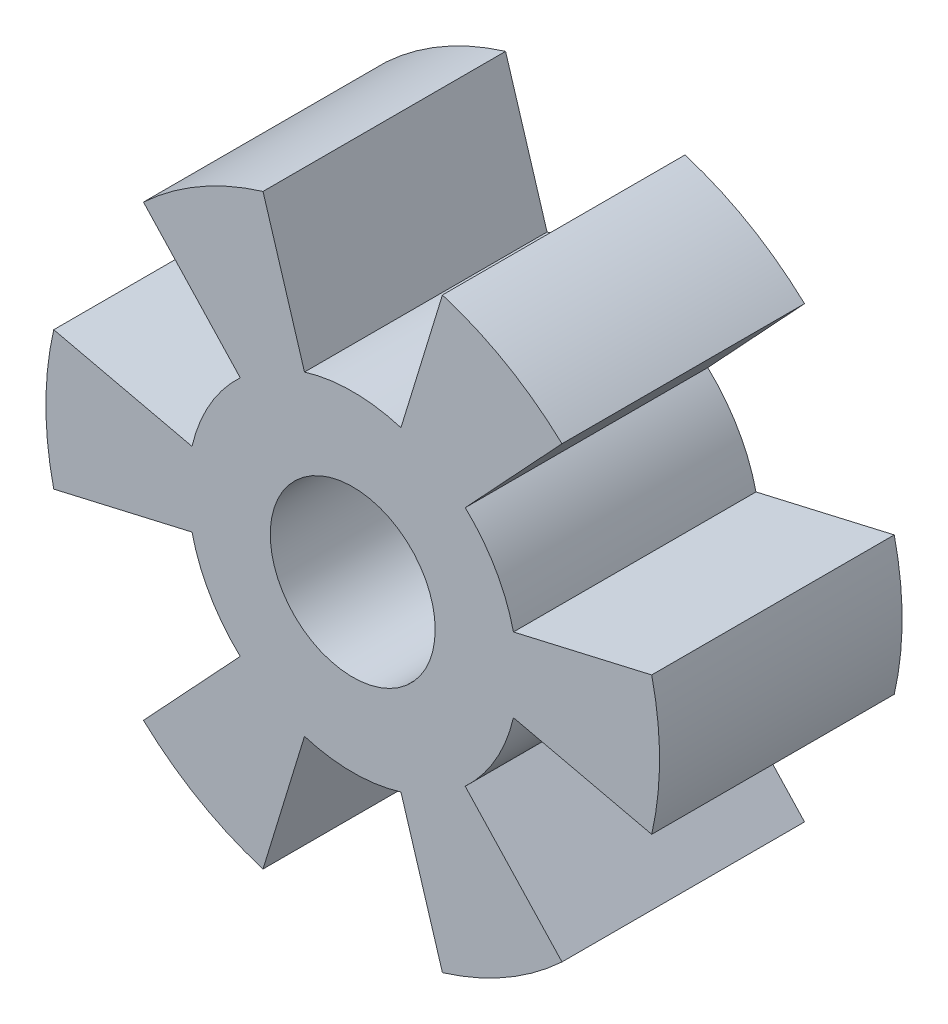
ISO-10303-21;
HEADER;
FILE_DESCRIPTION(('STEP AP214'),'2;1');
FILE_NAME('part.step','',(''),(''),'','','');
FILE_SCHEMA(('AUTOMOTIVE_DESIGN { 1 0 10303 214 1 1 1 1 }'));
ENDSEC;
DATA;
#1=APPLICATION_CONTEXT('core data for automotive mechanical design processes');
#2=APPLICATION_PROTOCOL_DEFINITION('international standard','automotive_design',2000,#1);
#3=PRODUCT_CONTEXT('',#1,'mechanical');
#4=PRODUCT('Part','Part','',(#3));
#5=PRODUCT_RELATED_PRODUCT_CATEGORY('part','',(#4));
#6=PRODUCT_DEFINITION_FORMATION('','',#4);
#7=PRODUCT_DEFINITION_CONTEXT('part definition',#1,'design');
#8=PRODUCT_DEFINITION('design','',#6,#7);
#9=PRODUCT_DEFINITION_SHAPE('','',#8);
#10=(LENGTH_UNIT() NAMED_UNIT(*) SI_UNIT(.MILLI.,.METRE.));
#11=(NAMED_UNIT(*) PLANE_ANGLE_UNIT() SI_UNIT($,.RADIAN.));
#12=(NAMED_UNIT(*) SI_UNIT($,.STERADIAN.) SOLID_ANGLE_UNIT());
#13=UNCERTAINTY_MEASURE_WITH_UNIT(LENGTH_MEASURE(1.E-05),#10,'distance_accuracy_value','');
#14=(GEOMETRIC_REPRESENTATION_CONTEXT(3) GLOBAL_UNCERTAINTY_ASSIGNED_CONTEXT((#13)) GLOBAL_UNIT_ASSIGNED_CONTEXT((#10,
#11,#12)) REPRESENTATION_CONTEXT('',''));
#15=CARTESIAN_POINT('',(0.,0.,0.));
#16=DIRECTION('',(0.,0.,1.));
#17=DIRECTION('',(1.,0.,0.));
#18=AXIS2_PLACEMENT_3D('',#15,#16,#17);
#19=CARTESIAN_POINT('',(0.,0.,10.));
#20=DIRECTION('',(0.,0.,-1.));
#21=DIRECTION('',(1.,0.,0.));
#22=AXIS2_PLACEMENT_3D('',#19,#20,#21);
#23=CYLINDRICAL_SURFACE('',#22,3.4);
#24=CARTESIAN_POINT('',(0.,0.,20.));
#25=DIRECTION('',(0.,0.,1.));
#26=DIRECTION('',(1.,0.,0.));
#27=AXIS2_PLACEMENT_3D('',#24,#25,#26);
#28=CIRCLE('',#27,3.4);
#29=CARTESIAN_POINT('',(3.40000000000003,0.,20.));
#30=VERTEX_POINT('',#29);
#31=EDGE_CURVE('E386',#30,#30,#28,.T.);
#32=ORIENTED_EDGE('',*,*,#31,.T.);
#33=EDGE_LOOP('',(#32));
#34=FACE_BOUND('',#33,.T.);
#35=CARTESIAN_POINT('',(0.,0.,10.));
#36=DIRECTION('',(0.,0.,1.));
#37=DIRECTION('',(1.,0.,0.));
#38=AXIS2_PLACEMENT_3D('',#35,#36,#37);
#39=CIRCLE('',#38,3.4);
#40=CARTESIAN_POINT('',(3.40000000000003,0.,10.));
#41=VERTEX_POINT('',#40);
#42=EDGE_CURVE('E262',#41,#41,#39,.T.);
#43=ORIENTED_EDGE('',*,*,#42,.F.);
#44=EDGE_LOOP('',(#43));
#45=FACE_BOUND('',#44,.T.);
#46=ADVANCED_FACE('F17',(#34,#45),#23,.F.);
#47=CARTESIAN_POINT('',(0.,0.,10.));
#48=DIRECTION('',(0.,0.,-1.));
#49=DIRECTION('',(1.,0.,0.));
#50=AXIS2_PLACEMENT_3D('',#47,#48,#49);
#51=CYLINDRICAL_SURFACE('',#50,6.8);
#52=DIRECTION('',(0.,0.,-1.));
#53=VECTOR('',#52,1.);
#54=CARTESIAN_POINT('',(1.988127592115,-6.502872340549,10.));
#55=LINE('',#54,#53);
#56=CARTESIAN_POINT('',(1.988127592114,-6.502872340549,20.));
#57=VERTEX_POINT('',#56);
#58=CARTESIAN_POINT('',(1.988127592114,-6.502872340549,10.));
#59=VERTEX_POINT('',#58);
#60=EDGE_CURVE('E11',#57,#59,#55,.T.);
#61=ORIENTED_EDGE('',*,*,#60,.F.);
#62=CARTESIAN_POINT('',(0.,0.,20.));
#63=DIRECTION('',(0.,0.,1.));
#64=DIRECTION('',(1.,0.,0.));
#65=AXIS2_PLACEMENT_3D('',#62,#63,#64);
#66=CIRCLE('',#65,6.8);
#67=CARTESIAN_POINT('',(-1.988127592114,-6.502872340549,20.));
#68=VERTEX_POINT('',#67);
#69=EDGE_CURVE('E237',#68,#57,#66,.T.);
#70=ORIENTED_EDGE('',*,*,#69,.F.);
#71=DIRECTION('',(0.,0.,-1.));
#72=VECTOR('',#71,1.);
#73=CARTESIAN_POINT('',(-1.988127592115,-6.502872340549,10.));
#74=LINE('',#73,#72);
#75=CARTESIAN_POINT('',(-1.988127592114,-6.502872340549,10.));
#76=VERTEX_POINT('',#75);
#77=EDGE_CURVE('E234',#68,#76,#74,.T.);
#78=ORIENTED_EDGE('',*,*,#77,.T.);
#79=CARTESIAN_POINT('',(0.,0.,10.));
#80=DIRECTION('',(0.,0.,1.));
#81=DIRECTION('',(1.,0.,0.));
#82=AXIS2_PLACEMENT_3D('',#79,#80,#81);
#83=CIRCLE('',#82,6.8);
#84=EDGE_CURVE('E240',#76,#59,#83,.T.);
#85=ORIENTED_EDGE('',*,*,#84,.T.);
#86=EDGE_LOOP('',(#61,#70,#78,#85));
#87=FACE_BOUND('',#86,.T.);
#88=ADVANCED_FACE('F233',(#87),#51,.T.);
#89=CARTESIAN_POINT('',(0.994063796057,-3.251436170274,10.));
#90=DIRECTION('',(0.956304755962959,0.292371704722988,0.));
#91=DIRECTION('',(0.,0.,-1.));
#92=AXIS2_PLACEMENT_3D('',#89,#90,#91);
#93=PLANE('',#92);
#94=DIRECTION('',(0.,0.,1.));
#95=VECTOR('',#94,1.);
#96=CARTESIAN_POINT('',(3.698502064743,-12.09725516293,10.));
#97=LINE('',#96,#95);
#98=CARTESIAN_POINT('',(3.698502064743,-12.09725516293,10.));
#99=VERTEX_POINT('',#98);
#100=CARTESIAN_POINT('',(3.698502064743,-12.09725516293,20.));
#101=VERTEX_POINT('',#100);
#102=EDGE_CURVE('E20',#99,#101,#97,.T.);
#103=ORIENTED_EDGE('',*,*,#102,.T.);
#104=DIRECTION('',(0.292371704722988,-0.956304755962959,0.));
#105=VECTOR('',#104,1.);
#106=CARTESIAN_POINT('',(0.994063796057,-3.251436170274,20.));
#107=LINE('',#106,#105);
#108=EDGE_CURVE('E395',#57,#101,#107,.T.);
#109=ORIENTED_EDGE('',*,*,#108,.F.);
#110=ORIENTED_EDGE('',*,*,#60,.T.);
#111=DIRECTION('',(0.292371704722988,-0.956304755962959,0.));
#112=VECTOR('',#111,1.);
#113=CARTESIAN_POINT('',(0.994063796057,-3.251436170274,10.));
#114=LINE('',#113,#112);
#115=EDGE_CURVE('E254',#59,#99,#114,.T.);
#116=ORIENTED_EDGE('',*,*,#115,.T.);
#117=EDGE_LOOP('',(#103,#109,#110,#116));
#118=FACE_BOUND('',#117,.T.);
#119=ADVANCED_FACE('F509',(#118),#93,.F.);
#120=CARTESIAN_POINT('',(0.,0.,10.));
#121=DIRECTION('',(0.,0.,-1.));
#122=DIRECTION('',(0.292371704722988,-0.956304755962959,0.));
#123=AXIS2_PLACEMENT_3D('',#120,#121,#122);
#124=CYLINDRICAL_SURFACE('',#123,12.65);
#125=CARTESIAN_POINT('',(0.,0.,10.));
#126=DIRECTION('',(0.,0.,1.));
#127=DIRECTION('',(0.292371704722988,-0.956304755962959,0.));
#128=AXIS2_PLACEMENT_3D('',#125,#126,#127);
#129=CIRCLE('',#128,12.65);
#130=CARTESIAN_POINT('',(8.627279254791,-9.251624325483,10.));
#131=VERTEX_POINT('',#130);
#132=EDGE_CURVE('E320',#99,#131,#129,.T.);
#133=ORIENTED_EDGE('',*,*,#132,.T.);
#134=DIRECTION('',(0.,0.,1.));
#135=VECTOR('',#134,1.);
#136=CARTESIAN_POINT('',(8.627279254791,-9.251624325483,10.));
#137=LINE('',#136,#135);
#138=CARTESIAN_POINT('',(8.627279254791,-9.251624325483,20.));
#139=VERTEX_POINT('',#138);
#140=EDGE_CURVE('E500',#131,#139,#137,.T.);
#141=ORIENTED_EDGE('',*,*,#140,.T.);
#142=CARTESIAN_POINT('',(0.,0.,20.));
#143=DIRECTION('',(0.,0.,1.));
#144=DIRECTION('',(0.292371704722988,-0.956304755962959,0.));
#145=AXIS2_PLACEMENT_3D('',#142,#143,#144);
#146=CIRCLE('',#145,12.65);
#147=EDGE_CURVE('E396',#101,#139,#146,.T.);
#148=ORIENTED_EDGE('',*,*,#147,.F.);
#149=ORIENTED_EDGE('',*,*,#102,.F.);
#150=EDGE_LOOP('',(#133,#141,#148,#149));
#151=FACE_BOUND('',#150,.T.);
#152=ADVANCED_FACE('F506',(#151),#124,.T.);
#153=CARTESIAN_POINT('',(8.627279254791,-9.251624325483,10.));
#154=DIRECTION('',(-0.73135370161934,-0.681998360062317,0.));
#155=DIRECTION('',(-0.681998360062317,0.73135370161934,0.));
#156=AXIS2_PLACEMENT_3D('',#153,#154,#155);
#157=PLANE('',#156);
#158=DIRECTION('',(0.,0.,-1.));
#159=VECTOR('',#158,1.);
#160=CARTESIAN_POINT('',(4.637588848425,-4.97320517101,10.));
#161=LINE('',#160,#159);
#162=CARTESIAN_POINT('',(4.637588848425,-4.97320517101,20.));
#163=VERTEX_POINT('',#162);
#164=CARTESIAN_POINT('',(4.637588848425,-4.97320517101,10.));
#165=VERTEX_POINT('',#164);
#166=EDGE_CURVE('E494',#163,#165,#161,.T.);
#167=ORIENTED_EDGE('',*,*,#166,.F.);
#168=DIRECTION('',(-0.681998360062317,0.73135370161934,0.));
#169=VECTOR('',#168,1.);
#170=CARTESIAN_POINT('',(8.627279254791,-9.251624325483,20.));
#171=LINE('',#170,#169);
#172=EDGE_CURVE('E403',#139,#163,#171,.T.);
#173=ORIENTED_EDGE('',*,*,#172,.F.);
#174=ORIENTED_EDGE('',*,*,#140,.F.);
#175=DIRECTION('',(-0.681998360062317,0.73135370161934,0.));
#176=VECTOR('',#175,1.);
#177=CARTESIAN_POINT('',(8.627279254791,-9.251624325483,10.));
#178=LINE('',#177,#176);
#179=EDGE_CURVE('E321',#131,#165,#178,.T.);
#180=ORIENTED_EDGE('',*,*,#179,.T.);
#181=EDGE_LOOP('',(#167,#173,#174,#180));
#182=FACE_BOUND('',#181,.T.);
#183=ADVANCED_FACE('F650',(#182),#157,.F.);
#184=CARTESIAN_POINT('',(0.,0.,10.));
#185=DIRECTION('',(0.,0.,-1.));
#186=DIRECTION('',(1.,0.,0.));
#187=AXIS2_PLACEMENT_3D('',#184,#185,#186);
#188=CYLINDRICAL_SURFACE('',#187,6.8);
#189=DIRECTION('',(0.,0.,-1.));
#190=VECTOR('',#189,1.);
#191=CARTESIAN_POINT('',(6.62571644054,-1.529667169538,10.));
#192=LINE('',#191,#190);
#193=CARTESIAN_POINT('',(6.62571644054,-1.529667169538,20.));
#194=VERTEX_POINT('',#193);
#195=CARTESIAN_POINT('',(6.62571644054,-1.529667169538,10.));
#196=VERTEX_POINT('',#195);
#197=EDGE_CURVE('E495',#194,#196,#192,.T.);
#198=ORIENTED_EDGE('',*,*,#197,.F.);
#199=CARTESIAN_POINT('',(0.,0.,20.));
#200=DIRECTION('',(0.,0.,1.));
#201=DIRECTION('',(1.,0.,0.));
#202=AXIS2_PLACEMENT_3D('',#199,#200,#201);
#203=CIRCLE('',#202,6.8);
#204=EDGE_CURVE('E410',#163,#194,#203,.T.);
#205=ORIENTED_EDGE('',*,*,#204,.F.);
#206=ORIENTED_EDGE('',*,*,#166,.T.);
#207=CARTESIAN_POINT('',(0.,0.,10.));
#208=DIRECTION('',(0.,0.,1.));
#209=DIRECTION('',(1.,0.,0.));
#210=AXIS2_PLACEMENT_3D('',#207,#208,#209);
#211=CIRCLE('',#210,6.8);
#212=EDGE_CURVE('E368',#165,#196,#211,.T.);
#213=ORIENTED_EDGE('',*,*,#212,.T.);
#214=EDGE_LOOP('',(#198,#205,#206,#213));
#215=FACE_BOUND('',#214,.T.);
#216=ADVANCED_FACE('F641',(#215),#188,.T.);
#217=CARTESIAN_POINT('',(3.31285822027,-0.764833584769,10.));
#218=DIRECTION('',(0.224951054344045,0.974370064785194,0.));
#219=DIRECTION('',(0.,0.,-1.));
#220=AXIS2_PLACEMENT_3D('',#217,#218,#219);
#221=PLANE('',#220);
#222=DIRECTION('',(0.,0.,1.));
#223=VECTOR('',#222,1.);
#224=CARTESIAN_POINT('',(12.325781319533,-2.84563083745,10.));
#225=LINE('',#224,#223);
#226=CARTESIAN_POINT('',(12.325781319533,-2.84563083745,10.));
#227=VERTEX_POINT('',#226);
#228=CARTESIAN_POINT('',(12.325781319533,-2.84563083745,20.));
#229=VERTEX_POINT('',#228);
#230=EDGE_CURVE('E487',#227,#229,#225,.T.);
#231=ORIENTED_EDGE('',*,*,#230,.T.);
#232=DIRECTION('',(0.974370064785194,-0.224951054344045,0.));
#233=VECTOR('',#232,1.);
#234=CARTESIAN_POINT('',(3.31285822027,-0.764833584769,20.));
#235=LINE('',#234,#233);
#236=EDGE_CURVE('E411',#194,#229,#235,.T.);
#237=ORIENTED_EDGE('',*,*,#236,.F.);
#238=ORIENTED_EDGE('',*,*,#197,.T.);
#239=DIRECTION('',(0.974370064785194,-0.224951054344045,0.));
#240=VECTOR('',#239,1.);
#241=CARTESIAN_POINT('',(3.31285822027,-0.764833584769,10.));
#242=LINE('',#241,#240);
#243=EDGE_CURVE('E362',#196,#227,#242,.T.);
#244=ORIENTED_EDGE('',*,*,#243,.T.);
#245=EDGE_LOOP('',(#231,#237,#238,#244));
#246=FACE_BOUND('',#245,.T.);
#247=ADVANCED_FACE('F626',(#246),#221,.F.);
#248=CARTESIAN_POINT('',(0.,0.,10.));
#249=DIRECTION('',(0.,0.,-1.));
#250=DIRECTION('',(0.974370064785194,-0.224951054344045,0.));
#251=AXIS2_PLACEMENT_3D('',#248,#249,#250);
#252=CYLINDRICAL_SURFACE('',#251,12.65);
#253=CARTESIAN_POINT('',(0.,0.,10.));
#254=DIRECTION('',(0.,0.,1.));
#255=DIRECTION('',(0.974370064785194,-0.224951054344045,0.));
#256=AXIS2_PLACEMENT_3D('',#253,#254,#255);
#257=CIRCLE('',#256,12.65);
#258=CARTESIAN_POINT('',(12.325781319533,2.84563083745,10.));
#259=VERTEX_POINT('',#258);
#260=EDGE_CURVE('E358',#227,#259,#257,.T.);
#261=ORIENTED_EDGE('',*,*,#260,.T.);
#262=DIRECTION('',(0.,0.,1.));
#263=VECTOR('',#262,1.);
#264=CARTESIAN_POINT('',(12.325781319533,2.84563083745,10.));
#265=LINE('',#264,#263);
#266=CARTESIAN_POINT('',(12.325781319533,2.84563083745,20.));
#267=VERTEX_POINT('',#266);
#268=EDGE_CURVE('E486',#259,#267,#265,.T.);
#269=ORIENTED_EDGE('',*,*,#268,.T.);
#270=CARTESIAN_POINT('',(0.,0.,20.));
#271=DIRECTION('',(0.,0.,1.));
#272=DIRECTION('',(0.974370064785194,-0.224951054344045,0.));
#273=AXIS2_PLACEMENT_3D('',#270,#271,#272);
#274=CIRCLE('',#273,12.65);
#275=EDGE_CURVE('E414',#229,#267,#274,.T.);
#276=ORIENTED_EDGE('',*,*,#275,.F.);
#277=ORIENTED_EDGE('',*,*,#230,.F.);
#278=EDGE_LOOP('',(#261,#269,#276,#277));
#279=FACE_BOUND('',#278,.T.);
#280=ADVANCED_FACE('F621',(#279),#252,.T.);
#281=CARTESIAN_POINT('',(12.325781319533,2.84563083745,10.));
#282=DIRECTION('',(0.224951054344045,-0.974370064785194,0.));
#283=DIRECTION('',(0.,0.,-1.));
#284=AXIS2_PLACEMENT_3D('',#281,#282,#283);
#285=PLANE('',#284);
#286=DIRECTION('',(0.,0.,-1.));
#287=VECTOR('',#286,1.);
#288=CARTESIAN_POINT('',(6.62571644054,1.529667169538,10.));
#289=LINE('',#288,#287);
#290=CARTESIAN_POINT('',(6.62571644054,1.529667169538,20.));
#291=VERTEX_POINT('',#290);
#292=CARTESIAN_POINT('',(6.62571644054,1.529667169538,10.));
#293=VERTEX_POINT('',#292);
#294=EDGE_CURVE('E483',#291,#293,#289,.T.);
#295=ORIENTED_EDGE('',*,*,#294,.F.);
#296=DIRECTION('',(-0.974370064785194,-0.224951054344045,0.));
#297=VECTOR('',#296,1.);
#298=CARTESIAN_POINT('',(12.325781319533,2.84563083745,20.));
#299=LINE('',#298,#297);
#300=EDGE_CURVE('E420',#267,#291,#299,.T.);
#301=ORIENTED_EDGE('',*,*,#300,.F.);
#302=ORIENTED_EDGE('',*,*,#268,.F.);
#303=DIRECTION('',(-0.974370064785194,-0.224951054344045,0.));
#304=VECTOR('',#303,1.);
#305=CARTESIAN_POINT('',(12.325781319533,2.84563083745,10.));
#306=LINE('',#305,#304);
#307=EDGE_CURVE('E347',#259,#293,#306,.T.);
#308=ORIENTED_EDGE('',*,*,#307,.T.);
#309=EDGE_LOOP('',(#295,#301,#302,#308));
#310=FACE_BOUND('',#309,.T.);
#311=ADVANCED_FACE('F624',(#310),#285,.F.);
#312=CARTESIAN_POINT('',(0.,0.,10.));
#313=DIRECTION('',(0.,0.,-1.));
#314=DIRECTION('',(1.,0.,0.));
#315=AXIS2_PLACEMENT_3D('',#312,#313,#314);
#316=CYLINDRICAL_SURFACE('',#315,6.8);
#317=DIRECTION('',(0.,0.,-1.));
#318=VECTOR('',#317,1.);
#319=CARTESIAN_POINT('',(4.637588848425,4.97320517101,10.));
#320=LINE('',#319,#318);
#321=CARTESIAN_POINT('',(4.637588848425,4.97320517101,20.));
#322=VERTEX_POINT('',#321);
#323=CARTESIAN_POINT('',(4.637588848425,4.97320517101,10.));
#324=VERTEX_POINT('',#323);
#325=EDGE_CURVE('E477',#322,#324,#320,.T.);
#326=ORIENTED_EDGE('',*,*,#325,.F.);
#327=CARTESIAN_POINT('',(0.,0.,20.));
#328=DIRECTION('',(0.,0.,1.));
#329=DIRECTION('',(1.,0.,0.));
#330=AXIS2_PLACEMENT_3D('',#327,#328,#329);
#331=CIRCLE('',#330,6.8);
#332=EDGE_CURVE('E425',#291,#322,#331,.T.);
#333=ORIENTED_EDGE('',*,*,#332,.F.);
#334=ORIENTED_EDGE('',*,*,#294,.T.);
#335=CARTESIAN_POINT('',(0.,0.,10.));
#336=DIRECTION('',(0.,0.,1.));
#337=DIRECTION('',(1.,0.,0.));
#338=AXIS2_PLACEMENT_3D('',#335,#336,#337);
#339=CIRCLE('',#338,6.8);
#340=EDGE_CURVE('E328',#293,#324,#339,.T.);
#341=ORIENTED_EDGE('',*,*,#340,.T.);
#342=EDGE_LOOP('',(#326,#333,#334,#341));
#343=FACE_BOUND('',#342,.T.);
#344=ADVANCED_FACE('F544',(#343),#316,.T.);
#345=CARTESIAN_POINT('',(2.318794424212,2.486602585505,10.));
#346=DIRECTION('',(-0.73135370161934,0.681998360062317,0.));
#347=DIRECTION('',(0.,0.,1.));
#348=AXIS2_PLACEMENT_3D('',#345,#346,#347);
#349=PLANE('',#348);
#350=DIRECTION('',(0.,0.,1.));
#351=VECTOR('',#350,1.);
#352=CARTESIAN_POINT('',(8.627279254791,9.251624325483,10.));
#353=LINE('',#352,#351);
#354=CARTESIAN_POINT('',(8.627279254791,9.251624325483,10.));
#355=VERTEX_POINT('',#354);
#356=CARTESIAN_POINT('',(8.627279254791,9.251624325483,20.));
#357=VERTEX_POINT('',#356);
#358=EDGE_CURVE('E479',#355,#357,#353,.T.);
#359=ORIENTED_EDGE('',*,*,#358,.T.);
#360=DIRECTION('',(0.681998360062317,0.73135370161934,0.));
#361=VECTOR('',#360,1.);
#362=CARTESIAN_POINT('',(2.318794424212,2.486602585505,20.));
#363=LINE('',#362,#361);
#364=EDGE_CURVE('E303',#322,#357,#363,.T.);
#365=ORIENTED_EDGE('',*,*,#364,.F.);
#366=ORIENTED_EDGE('',*,*,#325,.T.);
#367=DIRECTION('',(0.681998360062317,0.73135370161934,0.));
#368=VECTOR('',#367,1.);
#369=CARTESIAN_POINT('',(2.318794424212,2.486602585505,10.));
#370=LINE('',#369,#368);
#371=EDGE_CURVE('E324',#324,#355,#370,.T.);
#372=ORIENTED_EDGE('',*,*,#371,.T.);
#373=EDGE_LOOP('',(#359,#365,#366,#372));
#374=FACE_BOUND('',#373,.T.);
#375=ADVANCED_FACE('F536',(#374),#349,.F.);
#376=CARTESIAN_POINT('',(0.,0.,10.));
#377=DIRECTION('',(0.,0.,-1.));
#378=DIRECTION('',(0.681998360062317,0.73135370161934,0.));
#379=AXIS2_PLACEMENT_3D('',#376,#377,#378);
#380=CYLINDRICAL_SURFACE('',#379,12.65);
#381=CARTESIAN_POINT('',(0.,0.,10.));
#382=DIRECTION('',(0.,0.,1.));
#383=DIRECTION('',(0.681998360062317,0.73135370161934,0.));
#384=AXIS2_PLACEMENT_3D('',#381,#382,#383);
#385=CIRCLE('',#384,12.65);
#386=CARTESIAN_POINT('',(3.698502064743,12.097255162932,10.));
#387=VERTEX_POINT('',#386);
#388=EDGE_CURVE('E329',#355,#387,#385,.T.);
#389=ORIENTED_EDGE('',*,*,#388,.T.);
#390=DIRECTION('',(0.,0.,1.));
#391=VECTOR('',#390,1.);
#392=CARTESIAN_POINT('',(3.698502064743,12.097255162932,10.));
#393=LINE('',#392,#391);
#394=CARTESIAN_POINT('',(3.698502064743,12.097255162932,20.));
#395=VERTEX_POINT('',#394);
#396=EDGE_CURVE('E478',#387,#395,#393,.T.);
#397=ORIENTED_EDGE('',*,*,#396,.T.);
#398=CARTESIAN_POINT('',(0.,0.,20.));
#399=DIRECTION('',(0.,0.,1.));
#400=DIRECTION('',(0.681998360062317,0.73135370161934,0.));
#401=AXIS2_PLACEMENT_3D('',#398,#399,#400);
#402=CIRCLE('',#401,12.65);
#403=EDGE_CURVE('E297',#357,#395,#402,.T.);
#404=ORIENTED_EDGE('',*,*,#403,.F.);
#405=ORIENTED_EDGE('',*,*,#358,.F.);
#406=EDGE_LOOP('',(#389,#397,#404,#405));
#407=FACE_BOUND('',#406,.T.);
#408=ADVANCED_FACE('F539',(#407),#380,.T.);
#409=CARTESIAN_POINT('',(3.698502064743,12.097255162932,10.));
#410=DIRECTION('',(0.956304755962959,-0.292371704722988,0.));
#411=DIRECTION('',(0.,0.,-1.));
#412=AXIS2_PLACEMENT_3D('',#409,#410,#411);
#413=PLANE('',#412);
#414=DIRECTION('',(0.,0.,-1.));
#415=VECTOR('',#414,1.);
#416=CARTESIAN_POINT('',(1.988127592115,6.502872340549,10.));
#417=LINE('',#416,#415);
#418=CARTESIAN_POINT('',(1.988127592114,6.502872340549,20.));
#419=VERTEX_POINT('',#418);
#420=CARTESIAN_POINT('',(1.988127592114,6.502872340549,10.));
#421=VERTEX_POINT('',#420);
#422=EDGE_CURVE('E288',#419,#421,#417,.T.);
#423=ORIENTED_EDGE('',*,*,#422,.F.);
#424=DIRECTION('',(-0.292371704722988,-0.956304755962959,0.));
#425=VECTOR('',#424,1.);
#426=CARTESIAN_POINT('',(3.698502064743,12.097255162932,20.));
#427=LINE('',#426,#425);
#428=EDGE_CURVE('E305',#395,#419,#427,.T.);
#429=ORIENTED_EDGE('',*,*,#428,.F.);
#430=ORIENTED_EDGE('',*,*,#396,.F.);
#431=DIRECTION('',(-0.292371704722988,-0.956304755962959,0.));
#432=VECTOR('',#431,1.);
#433=CARTESIAN_POINT('',(3.698502064743,12.097255162932,10.));
#434=LINE('',#433,#432);
#435=EDGE_CURVE('E285',#387,#421,#434,.T.);
#436=ORIENTED_EDGE('',*,*,#435,.T.);
#437=EDGE_LOOP('',(#423,#429,#430,#436));
#438=FACE_BOUND('',#437,.T.);
#439=ADVANCED_FACE('F555',(#438),#413,.F.);
#440=CARTESIAN_POINT('',(0.,0.,10.));
#441=DIRECTION('',(0.,0.,-1.));
#442=DIRECTION('',(1.,0.,0.));
#443=AXIS2_PLACEMENT_3D('',#440,#441,#442);
#444=CYLINDRICAL_SURFACE('',#443,6.8);
#445=DIRECTION('',(0.,0.,-1.));
#446=VECTOR('',#445,1.);
#447=CARTESIAN_POINT('',(-1.988127592115,6.502872340549,10.));
#448=LINE('',#447,#446);
#449=CARTESIAN_POINT('',(-1.988127592114,6.502872340549,20.));
#450=VERTEX_POINT('',#449);
#451=CARTESIAN_POINT('',(-1.988127592114,6.502872340549,10.));
#452=VERTEX_POINT('',#451);
#453=EDGE_CURVE('E290',#450,#452,#448,.T.);
#454=ORIENTED_EDGE('',*,*,#453,.F.);
#455=CARTESIAN_POINT('',(0.,0.,20.));
#456=DIRECTION('',(0.,0.,1.));
#457=DIRECTION('',(1.,0.,0.));
#458=AXIS2_PLACEMENT_3D('',#455,#456,#457);
#459=CIRCLE('',#458,6.8);
#460=EDGE_CURVE('E382',#419,#450,#459,.T.);
#461=ORIENTED_EDGE('',*,*,#460,.F.);
#462=ORIENTED_EDGE('',*,*,#422,.T.);
#463=CARTESIAN_POINT('',(0.,0.,10.));
#464=DIRECTION('',(0.,0.,1.));
#465=DIRECTION('',(1.,0.,0.));
#466=AXIS2_PLACEMENT_3D('',#463,#464,#465);
#467=CIRCLE('',#466,6.8);
#468=EDGE_CURVE('E281',#421,#452,#467,.T.);
#469=ORIENTED_EDGE('',*,*,#468,.T.);
#470=EDGE_LOOP('',(#454,#461,#462,#469));
#471=FACE_BOUND('',#470,.T.);
#472=ADVANCED_FACE('F556',(#471),#444,.T.);
#473=CARTESIAN_POINT('',(-0.994063796057,3.251436170274,10.));
#474=DIRECTION('',(-0.956304755962959,-0.292371704722988,0.));
#475=DIRECTION('',(-0.292371704722988,0.956304755962959,0.));
#476=AXIS2_PLACEMENT_3D('',#473,#474,#475);
#477=PLANE('',#476);
#478=DIRECTION('',(0.,0.,1.));
#479=VECTOR('',#478,1.);
#480=CARTESIAN_POINT('',(-3.698502064743,12.097255162932,10.));
#481=LINE('',#480,#479);
#482=CARTESIAN_POINT('',(-3.698502064743,12.097255162932,10.));
#483=VERTEX_POINT('',#482);
#484=CARTESIAN_POINT('',(-3.698502064743,12.097255162932,20.));
#485=VERTEX_POINT('',#484);
#486=EDGE_CURVE('E295',#483,#485,#481,.T.);
#487=ORIENTED_EDGE('',*,*,#486,.T.);
#488=DIRECTION('',(-0.292371704722988,0.956304755962959,0.));
#489=VECTOR('',#488,1.);
#490=CARTESIAN_POINT('',(-0.994063796057,3.251436170274,20.));
#491=LINE('',#490,#489);
#492=EDGE_CURVE('E377',#450,#485,#491,.T.);
#493=ORIENTED_EDGE('',*,*,#492,.F.);
#494=ORIENTED_EDGE('',*,*,#453,.T.);
#495=DIRECTION('',(-0.292371704722988,0.956304755962959,0.));
#496=VECTOR('',#495,1.);
#497=CARTESIAN_POINT('',(-0.994063796057,3.251436170274,10.));
#498=LINE('',#497,#496);
#499=EDGE_CURVE('E287',#452,#483,#498,.T.);
#500=ORIENTED_EDGE('',*,*,#499,.T.);
#501=EDGE_LOOP('',(#487,#493,#494,#500));
#502=FACE_BOUND('',#501,.T.);
#503=ADVANCED_FACE('F559',(#502),#477,.F.);
#504=CARTESIAN_POINT('',(0.,0.,10.));
#505=DIRECTION('',(0.,0.,-1.));
#506=DIRECTION('',(-0.292371704722988,0.956304755962959,0.));
#507=AXIS2_PLACEMENT_3D('',#504,#505,#506);
#508=CYLINDRICAL_SURFACE('',#507,12.65);
#509=CARTESIAN_POINT('',(0.,0.,10.));
#510=DIRECTION('',(0.,0.,1.));
#511=DIRECTION('',(-0.292371704722988,0.956304755962959,0.));
#512=AXIS2_PLACEMENT_3D('',#509,#510,#511);
#513=CIRCLE('',#512,12.65);
#514=CARTESIAN_POINT('',(-8.627279254791,9.251624325483,10.));
#515=VERTEX_POINT('',#514);
#516=EDGE_CURVE('E313',#483,#515,#513,.T.);
#517=ORIENTED_EDGE('',*,*,#516,.T.);
#518=DIRECTION('',(0.,0.,1.));
#519=VECTOR('',#518,1.);
#520=CARTESIAN_POINT('',(-8.627279254791,9.251624325483,10.));
#521=LINE('',#520,#519);
#522=CARTESIAN_POINT('',(-8.627279254791,9.251624325483,20.));
#523=VERTEX_POINT('',#522);
#524=EDGE_CURVE('E312',#515,#523,#521,.T.);
#525=ORIENTED_EDGE('',*,*,#524,.T.);
#526=CARTESIAN_POINT('',(0.,0.,20.));
#527=DIRECTION('',(0.,0.,1.));
#528=DIRECTION('',(-0.292371704722988,0.956304755962959,0.));
#529=AXIS2_PLACEMENT_3D('',#526,#527,#528);
#530=CIRCLE('',#529,12.65);
#531=EDGE_CURVE('E385',#485,#523,#530,.T.);
#532=ORIENTED_EDGE('',*,*,#531,.F.);
#533=ORIENTED_EDGE('',*,*,#486,.F.);
#534=EDGE_LOOP('',(#517,#525,#532,#533));
#535=FACE_BOUND('',#534,.T.);
#536=ADVANCED_FACE('F565',(#535),#508,.T.);
#537=CARTESIAN_POINT('',(-8.627279254791,9.251624325483,10.));
#538=DIRECTION('',(0.73135370161934,0.681998360062317,0.));
#539=DIRECTION('',(0.,0.,-1.));
#540=AXIS2_PLACEMENT_3D('',#537,#538,#539);
#541=PLANE('',#540);
#542=DIRECTION('',(0.,0.,-1.));
#543=VECTOR('',#542,1.);
#544=CARTESIAN_POINT('',(-4.637588848425,4.97320517101,10.));
#545=LINE('',#544,#543);
#546=CARTESIAN_POINT('',(-4.637588848425,4.97320517101,20.));
#547=VERTEX_POINT('',#546);
#548=CARTESIAN_POINT('',(-4.637588848425,4.97320517101,10.));
#549=VERTEX_POINT('',#548);
#550=EDGE_CURVE('E315',#547,#549,#545,.T.);
#551=ORIENTED_EDGE('',*,*,#550,.F.);
#552=DIRECTION('',(0.681998360062317,-0.73135370161934,0.));
#553=VECTOR('',#552,1.);
#554=CARTESIAN_POINT('',(-8.627279254791,9.251624325483,20.));
#555=LINE('',#554,#553);
#556=EDGE_CURVE('E438',#523,#547,#555,.T.);
#557=ORIENTED_EDGE('',*,*,#556,.F.);
#558=ORIENTED_EDGE('',*,*,#524,.F.);
#559=DIRECTION('',(0.681998360062317,-0.73135370161934,0.));
#560=VECTOR('',#559,1.);
#561=CARTESIAN_POINT('',(-8.627279254791,9.251624325483,10.));
#562=LINE('',#561,#560);
#563=EDGE_CURVE('E296',#515,#549,#562,.T.);
#564=ORIENTED_EDGE('',*,*,#563,.T.);
#565=EDGE_LOOP('',(#551,#557,#558,#564));
#566=FACE_BOUND('',#565,.T.);
#567=ADVANCED_FACE('F570',(#566),#541,.F.);
#568=CARTESIAN_POINT('',(0.,0.,10.));
#569=DIRECTION('',(0.,0.,-1.));
#570=DIRECTION('',(1.,0.,0.));
#571=AXIS2_PLACEMENT_3D('',#568,#569,#570);
#572=CYLINDRICAL_SURFACE('',#571,6.8);
#573=DIRECTION('',(0.,0.,-1.));
#574=VECTOR('',#573,1.);
#575=CARTESIAN_POINT('',(-6.62571644054,1.529667169538,10.));
#576=LINE('',#575,#574);
#577=CARTESIAN_POINT('',(-6.62571644054,1.529667169538,20.));
#578=VERTEX_POINT('',#577);
#579=CARTESIAN_POINT('',(-6.62571644054,1.529667169538,10.));
#580=VERTEX_POINT('',#579);
#581=EDGE_CURVE('E316',#578,#580,#576,.T.);
#582=ORIENTED_EDGE('',*,*,#581,.F.);
#583=CARTESIAN_POINT('',(0.,0.,20.));
#584=DIRECTION('',(0.,0.,1.));
#585=DIRECTION('',(1.,0.,0.));
#586=AXIS2_PLACEMENT_3D('',#583,#584,#585);
#587=CIRCLE('',#586,6.8);
#588=EDGE_CURVE('E444',#547,#578,#587,.T.);
#589=ORIENTED_EDGE('',*,*,#588,.F.);
#590=ORIENTED_EDGE('',*,*,#550,.T.);
#591=CARTESIAN_POINT('',(0.,0.,10.));
#592=DIRECTION('',(0.,0.,1.));
#593=DIRECTION('',(1.,0.,0.));
#594=AXIS2_PLACEMENT_3D('',#591,#592,#593);
#595=CIRCLE('',#594,6.8);
#596=EDGE_CURVE('E291',#549,#580,#595,.T.);
#597=ORIENTED_EDGE('',*,*,#596,.T.);
#598=EDGE_LOOP('',(#582,#589,#590,#597));
#599=FACE_BOUND('',#598,.T.);
#600=ADVANCED_FACE('F569',(#599),#572,.T.);
#601=CARTESIAN_POINT('',(-3.31285822027,0.764833584769,10.));
#602=DIRECTION('',(-0.224951054344045,-0.974370064785194,0.));
#603=DIRECTION('',(-0.974370064785194,0.224951054344045,0.));
#604=AXIS2_PLACEMENT_3D('',#601,#602,#603);
#605=PLANE('',#604);
#606=DIRECTION('',(0.,0.,1.));
#607=VECTOR('',#606,1.);
#608=CARTESIAN_POINT('',(-12.32578131953,2.84563083745,10.));
#609=LINE('',#608,#607);
#610=CARTESIAN_POINT('',(-12.32578131953,2.84563083745,10.));
#611=VERTEX_POINT('',#610);
#612=CARTESIAN_POINT('',(-12.32578131953,2.84563083745,20.));
#613=VERTEX_POINT('',#612);
#614=EDGE_CURVE('E352',#611,#613,#609,.T.);
#615=ORIENTED_EDGE('',*,*,#614,.T.);
#616=DIRECTION('',(-0.974370064785194,0.224951054344045,0.));
#617=VECTOR('',#616,1.);
#618=CARTESIAN_POINT('',(-3.31285822027,0.764833584769,20.));
#619=LINE('',#618,#617);
#620=EDGE_CURVE('E447',#578,#613,#619,.T.);
#621=ORIENTED_EDGE('',*,*,#620,.F.);
#622=ORIENTED_EDGE('',*,*,#581,.T.);
#623=DIRECTION('',(-0.974370064785194,0.224951054344045,0.));
#624=VECTOR('',#623,1.);
#625=CARTESIAN_POINT('',(-3.31285822027,0.764833584769,10.));
#626=LINE('',#625,#624);
#627=EDGE_CURVE('E300',#580,#611,#626,.T.);
#628=ORIENTED_EDGE('',*,*,#627,.T.);
#629=EDGE_LOOP('',(#615,#621,#622,#628));
#630=FACE_BOUND('',#629,.T.);
#631=ADVANCED_FACE('F573',(#630),#605,.F.);
#632=CARTESIAN_POINT('',(0.,0.,10.));
#633=DIRECTION('',(0.,0.,-1.));
#634=DIRECTION('',(-0.974370064785194,0.224951054344045,0.));
#635=AXIS2_PLACEMENT_3D('',#632,#633,#634);
#636=CYLINDRICAL_SURFACE('',#635,12.65);
#637=CARTESIAN_POINT('',(0.,0.,10.));
#638=DIRECTION('',(0.,0.,1.));
#639=DIRECTION('',(-0.974370064785194,0.224951054344045,0.));
#640=AXIS2_PLACEMENT_3D('',#637,#638,#639);
#641=CIRCLE('',#640,12.65);
#642=CARTESIAN_POINT('',(-12.32578131953,-2.84563083745,10.));
#643=VERTEX_POINT('',#642);
#644=EDGE_CURVE('E307',#611,#643,#641,.T.);
#645=ORIENTED_EDGE('',*,*,#644,.T.);
#646=DIRECTION('',(0.,0.,1.));
#647=VECTOR('',#646,1.);
#648=CARTESIAN_POINT('',(-12.32578131953,-2.84563083745,10.));
#649=LINE('',#648,#647);
#650=CARTESIAN_POINT('',(-12.32578131953,-2.84563083745,20.));
#651=VERTEX_POINT('',#650);
#652=EDGE_CURVE('E349',#643,#651,#649,.T.);
#653=ORIENTED_EDGE('',*,*,#652,.T.);
#654=CARTESIAN_POINT('',(0.,0.,20.));
#655=DIRECTION('',(0.,0.,1.));
#656=DIRECTION('',(-0.974370064785194,0.224951054344045,0.));
#657=AXIS2_PLACEMENT_3D('',#654,#655,#656);
#658=CIRCLE('',#657,12.65);
#659=EDGE_CURVE('E345',#613,#651,#658,.T.);
#660=ORIENTED_EDGE('',*,*,#659,.F.);
#661=ORIENTED_EDGE('',*,*,#614,.F.);
#662=EDGE_LOOP('',(#645,#653,#660,#661));
#663=FACE_BOUND('',#662,.T.);
#664=ADVANCED_FACE('F580',(#663),#636,.T.);
#665=CARTESIAN_POINT('',(-12.32578131953,-2.84563083745,10.));
#666=DIRECTION('',(-0.224951054344045,0.974370064785194,0.));
#667=DIRECTION('',(0.,0.,1.));
#668=AXIS2_PLACEMENT_3D('',#665,#666,#667);
#669=PLANE('',#668);
#670=DIRECTION('',(0.,0.,-1.));
#671=VECTOR('',#670,1.);
#672=CARTESIAN_POINT('',(-6.62571644054,-1.529667169538,10.));
#673=LINE('',#672,#671);
#674=CARTESIAN_POINT('',(-6.62571644054,-1.529667169538,20.));
#675=VERTEX_POINT('',#674);
#676=CARTESIAN_POINT('',(-6.62571644054,-1.529667169538,10.));
#677=VERTEX_POINT('',#676);
#678=EDGE_CURVE('E353',#675,#677,#673,.T.);
#679=ORIENTED_EDGE('',*,*,#678,.F.);
#680=DIRECTION('',(0.974370064785194,0.224951054344045,0.));
#681=VECTOR('',#680,1.);
#682=CARTESIAN_POINT('',(-12.32578131953,-2.84563083745,20.));
#683=LINE('',#682,#681);
#684=EDGE_CURVE('E337',#651,#675,#683,.T.);
#685=ORIENTED_EDGE('',*,*,#684,.F.);
#686=ORIENTED_EDGE('',*,*,#652,.F.);
#687=DIRECTION('',(0.974370064785194,0.224951054344045,0.));
#688=VECTOR('',#687,1.);
#689=CARTESIAN_POINT('',(-12.32578131953,-2.84563083745,10.));
#690=LINE('',#689,#688);
#691=EDGE_CURVE('E278',#643,#677,#690,.T.);
#692=ORIENTED_EDGE('',*,*,#691,.T.);
#693=EDGE_LOOP('',(#679,#685,#686,#692));
#694=FACE_BOUND('',#693,.T.);
#695=ADVANCED_FACE('F523',(#694),#669,.F.);
#696=CARTESIAN_POINT('',(0.,0.,10.));
#697=DIRECTION('',(0.,0.,-1.));
#698=DIRECTION('',(1.,0.,0.));
#699=AXIS2_PLACEMENT_3D('',#696,#697,#698);
#700=CYLINDRICAL_SURFACE('',#699,6.8);
#701=DIRECTION('',(0.,0.,-1.));
#702=VECTOR('',#701,1.);
#703=CARTESIAN_POINT('',(-4.637588848425,-4.97320517101,10.));
#704=LINE('',#703,#702);
#705=CARTESIAN_POINT('',(-4.637588848425,-4.97320517101,20.));
#706=VERTEX_POINT('',#705);
#707=CARTESIAN_POINT('',(-4.637588848425,-4.97320517101,10.));
#708=VERTEX_POINT('',#707);
#709=EDGE_CURVE('E49',#706,#708,#704,.T.);
#710=ORIENTED_EDGE('',*,*,#709,.F.);
#711=CARTESIAN_POINT('',(0.,0.,20.));
#712=DIRECTION('',(0.,0.,1.));
#713=DIRECTION('',(1.,0.,0.));
#714=AXIS2_PLACEMENT_3D('',#711,#712,#713);
#715=CIRCLE('',#714,6.8);
#716=EDGE_CURVE('E342',#675,#706,#715,.T.);
#717=ORIENTED_EDGE('',*,*,#716,.F.);
#718=ORIENTED_EDGE('',*,*,#678,.T.);
#719=CARTESIAN_POINT('',(0.,0.,10.));
#720=DIRECTION('',(0.,0.,1.));
#721=DIRECTION('',(1.,0.,0.));
#722=AXIS2_PLACEMENT_3D('',#719,#720,#721);
#723=CIRCLE('',#722,6.8);
#724=EDGE_CURVE('E280',#677,#708,#723,.T.);
#725=ORIENTED_EDGE('',*,*,#724,.T.);
#726=EDGE_LOOP('',(#710,#717,#718,#725));
#727=FACE_BOUND('',#726,.T.);
#728=ADVANCED_FACE('F518',(#727),#700,.T.);
#729=CARTESIAN_POINT('',(-2.318794424212,-2.486602585505,10.));
#730=DIRECTION('',(0.73135370161934,-0.681998360062317,0.));
#731=DIRECTION('',(0.,0.,-1.));
#732=AXIS2_PLACEMENT_3D('',#729,#730,#731);
#733=PLANE('',#732);
#734=DIRECTION('',(0.,0.,1.));
#735=VECTOR('',#734,1.);
#736=CARTESIAN_POINT('',(-8.627279254791,-9.251624325483,10.));
#737=LINE('',#736,#735);
#738=CARTESIAN_POINT('',(-8.627279254791,-9.251624325483,10.));
#739=VERTEX_POINT('',#738);
#740=CARTESIAN_POINT('',(-8.627279254791,-9.251624325483,20.));
#741=VERTEX_POINT('',#740);
#742=EDGE_CURVE('E36',#739,#741,#737,.T.);
#743=ORIENTED_EDGE('',*,*,#742,.T.);
#744=DIRECTION('',(-0.681998360062317,-0.73135370161934,0.));
#745=VECTOR('',#744,1.);
#746=CARTESIAN_POINT('',(-2.318794424212,-2.486602585505,20.));
#747=LINE('',#746,#745);
#748=EDGE_CURVE('E367',#706,#741,#747,.T.);
#749=ORIENTED_EDGE('',*,*,#748,.F.);
#750=ORIENTED_EDGE('',*,*,#709,.T.);
#751=DIRECTION('',(-0.681998360062317,-0.73135370161934,0.));
#752=VECTOR('',#751,1.);
#753=CARTESIAN_POINT('',(-2.318794424212,-2.486602585505,10.));
#754=LINE('',#753,#752);
#755=EDGE_CURVE('E267',#708,#739,#754,.T.);
#756=ORIENTED_EDGE('',*,*,#755,.T.);
#757=EDGE_LOOP('',(#743,#749,#750,#756));
#758=FACE_BOUND('',#757,.T.);
#759=ADVANCED_FACE('F517',(#758),#733,.F.);
#760=CARTESIAN_POINT('',(0.,0.,10.));
#761=DIRECTION('',(0.,0.,-1.));
#762=DIRECTION('',(-0.681998360062317,-0.73135370161934,0.));
#763=AXIS2_PLACEMENT_3D('',#760,#761,#762);
#764=CYLINDRICAL_SURFACE('',#763,12.65);
#765=CARTESIAN_POINT('',(0.,0.,10.));
#766=DIRECTION('',(0.,0.,1.));
#767=DIRECTION('',(-0.681998360062317,-0.73135370161934,0.));
#768=AXIS2_PLACEMENT_3D('',#765,#766,#767);
#769=CIRCLE('',#768,12.65);
#770=CARTESIAN_POINT('',(-3.698502064743,-12.09725516293,10.));
#771=VERTEX_POINT('',#770);
#772=EDGE_CURVE('E263',#739,#771,#769,.T.);
#773=ORIENTED_EDGE('',*,*,#772,.T.);
#774=DIRECTION('',(0.,0.,1.));
#775=VECTOR('',#774,1.);
#776=CARTESIAN_POINT('',(-3.698502064743,-12.09725516293,10.));
#777=LINE('',#776,#775);
#778=CARTESIAN_POINT('',(-3.698502064743,-12.09725516293,20.));
#779=VERTEX_POINT('',#778);
#780=EDGE_CURVE('E257',#771,#779,#777,.T.);
#781=ORIENTED_EDGE('',*,*,#780,.T.);
#782=CARTESIAN_POINT('',(0.,0.,20.));
#783=DIRECTION('',(0.,0.,1.));
#784=DIRECTION('',(-0.681998360062317,-0.73135370161934,0.));
#785=AXIS2_PLACEMENT_3D('',#782,#783,#784);
#786=CIRCLE('',#785,12.65);
#787=EDGE_CURVE('E456',#741,#779,#786,.T.);
#788=ORIENTED_EDGE('',*,*,#787,.F.);
#789=ORIENTED_EDGE('',*,*,#742,.F.);
#790=EDGE_LOOP('',(#773,#781,#788,#789));
#791=FACE_BOUND('',#790,.T.);
#792=ADVANCED_FACE('F512',(#791),#764,.T.);
#793=CARTESIAN_POINT('',(0.,0.,20.));
#794=DIRECTION('',(0.,0.,1.));
#795=DIRECTION('',(1.,0.,0.));
#796=AXIS2_PLACEMENT_3D('',#793,#794,#795);
#797=PLANE('',#796);
#798=ORIENTED_EDGE('',*,*,#69,.T.);
#799=ORIENTED_EDGE('',*,*,#108,.T.);
#800=ORIENTED_EDGE('',*,*,#147,.T.);
#801=ORIENTED_EDGE('',*,*,#172,.T.);
#802=ORIENTED_EDGE('',*,*,#204,.T.);
#803=ORIENTED_EDGE('',*,*,#236,.T.);
#804=ORIENTED_EDGE('',*,*,#275,.T.);
#805=ORIENTED_EDGE('',*,*,#300,.T.);
#806=ORIENTED_EDGE('',*,*,#332,.T.);
#807=ORIENTED_EDGE('',*,*,#364,.T.);
#808=ORIENTED_EDGE('',*,*,#403,.T.);
#809=ORIENTED_EDGE('',*,*,#428,.T.);
#810=ORIENTED_EDGE('',*,*,#460,.T.);
#811=ORIENTED_EDGE('',*,*,#492,.T.);
#812=ORIENTED_EDGE('',*,*,#531,.T.);
#813=ORIENTED_EDGE('',*,*,#556,.T.);
#814=ORIENTED_EDGE('',*,*,#588,.T.);
#815=ORIENTED_EDGE('',*,*,#620,.T.);
#816=ORIENTED_EDGE('',*,*,#659,.T.);
#817=ORIENTED_EDGE('',*,*,#684,.T.);
#818=ORIENTED_EDGE('',*,*,#716,.T.);
#819=ORIENTED_EDGE('',*,*,#748,.T.);
#820=ORIENTED_EDGE('',*,*,#787,.T.);
#821=DIRECTION('',(0.292371704722988,0.956304755962959,0.));
#822=VECTOR('',#821,1.);
#823=CARTESIAN_POINT('',(-3.698502064743,-12.09725516293,20.));
#824=LINE('',#823,#822);
#825=EDGE_CURVE('E244',#779,#68,#824,.T.);
#826=ORIENTED_EDGE('',*,*,#825,.T.);
#827=EDGE_LOOP('',(#798,#799,#800,#801,#802,#803,#804,#805,#806,#807,#808,#809,#810,#811,#812,
#813,#814,#815,#816,#817,#818,#819,#820,#826));
#828=FACE_BOUND('',#827,.T.);
#829=ORIENTED_EDGE('',*,*,#31,.F.);
#830=EDGE_LOOP('',(#829));
#831=FACE_BOUND('',#830,.T.);
#832=ADVANCED_FACE('F515',(#828,#831),#797,.T.);
#833=CARTESIAN_POINT('',(-3.698502064743,-12.09725516293,10.));
#834=DIRECTION('',(-0.956304755962959,0.292371704722988,0.));
#835=DIRECTION('',(0.,0.,1.));
#836=AXIS2_PLACEMENT_3D('',#833,#834,#835);
#837=PLANE('',#836);
#838=ORIENTED_EDGE('',*,*,#77,.F.);
#839=ORIENTED_EDGE('',*,*,#825,.F.);
#840=ORIENTED_EDGE('',*,*,#780,.F.);
#841=DIRECTION('',(0.292371704722988,0.956304755962959,0.));
#842=VECTOR('',#841,1.);
#843=CARTESIAN_POINT('',(-3.698502064743,-12.09725516293,10.));
#844=LINE('',#843,#842);
#845=EDGE_CURVE('E252',#771,#76,#844,.T.);
#846=ORIENTED_EDGE('',*,*,#845,.T.);
#847=EDGE_LOOP('',(#838,#839,#840,#846));
#848=FACE_BOUND('',#847,.T.);
#849=ADVANCED_FACE('F256',(#848),#837,.F.);
#850=CARTESIAN_POINT('',(0.,0.,10.));
#851=DIRECTION('',(0.,0.,1.));
#852=DIRECTION('',(1.,0.,0.));
#853=AXIS2_PLACEMENT_3D('',#850,#851,#852);
#854=PLANE('',#853);
#855=ORIENTED_EDGE('',*,*,#845,.F.);
#856=ORIENTED_EDGE('',*,*,#772,.F.);
#857=ORIENTED_EDGE('',*,*,#755,.F.);
#858=ORIENTED_EDGE('',*,*,#724,.F.);
#859=ORIENTED_EDGE('',*,*,#691,.F.);
#860=ORIENTED_EDGE('',*,*,#644,.F.);
#861=ORIENTED_EDGE('',*,*,#627,.F.);
#862=ORIENTED_EDGE('',*,*,#596,.F.);
#863=ORIENTED_EDGE('',*,*,#563,.F.);
#864=ORIENTED_EDGE('',*,*,#516,.F.);
#865=ORIENTED_EDGE('',*,*,#499,.F.);
#866=ORIENTED_EDGE('',*,*,#468,.F.);
#867=ORIENTED_EDGE('',*,*,#435,.F.);
#868=ORIENTED_EDGE('',*,*,#388,.F.);
#869=ORIENTED_EDGE('',*,*,#371,.F.);
#870=ORIENTED_EDGE('',*,*,#340,.F.);
#871=ORIENTED_EDGE('',*,*,#307,.F.);
#872=ORIENTED_EDGE('',*,*,#260,.F.);
#873=ORIENTED_EDGE('',*,*,#243,.F.);
#874=ORIENTED_EDGE('',*,*,#212,.F.);
#875=ORIENTED_EDGE('',*,*,#179,.F.);
#876=ORIENTED_EDGE('',*,*,#132,.F.);
#877=ORIENTED_EDGE('',*,*,#115,.F.);
#878=ORIENTED_EDGE('',*,*,#84,.F.);
#879=EDGE_LOOP('',(#855,#856,#857,#858,#859,#860,#861,#862,#863,#864,#865,#866,#867,#868,#869,
#870,#871,#872,#873,#874,#875,#876,#877,#878));
#880=FACE_BOUND('',#879,.T.);
#881=ORIENTED_EDGE('',*,*,#42,.T.);
#882=EDGE_LOOP('',(#881));
#883=FACE_BOUND('',#882,.T.);
#884=ADVANCED_FACE('F247',(#880,#883),#854,.F.);
#885=CLOSED_SHELL('',(#46,#88,#119,#152,#183,#216,#247,#280,#311,#344,#375,#408,#439,#472,#503,
#536,#567,#600,#631,#664,#695,#728,#759,#792,#832,#849,#884));
#886=MANIFOLD_SOLID_BREP('B1',#885);
#887=ADVANCED_BREP_SHAPE_REPRESENTATION('',(#18,#886),#14);
#888=SHAPE_DEFINITION_REPRESENTATION(#9,#887);
ENDSEC;
END-ISO-10303-21;
